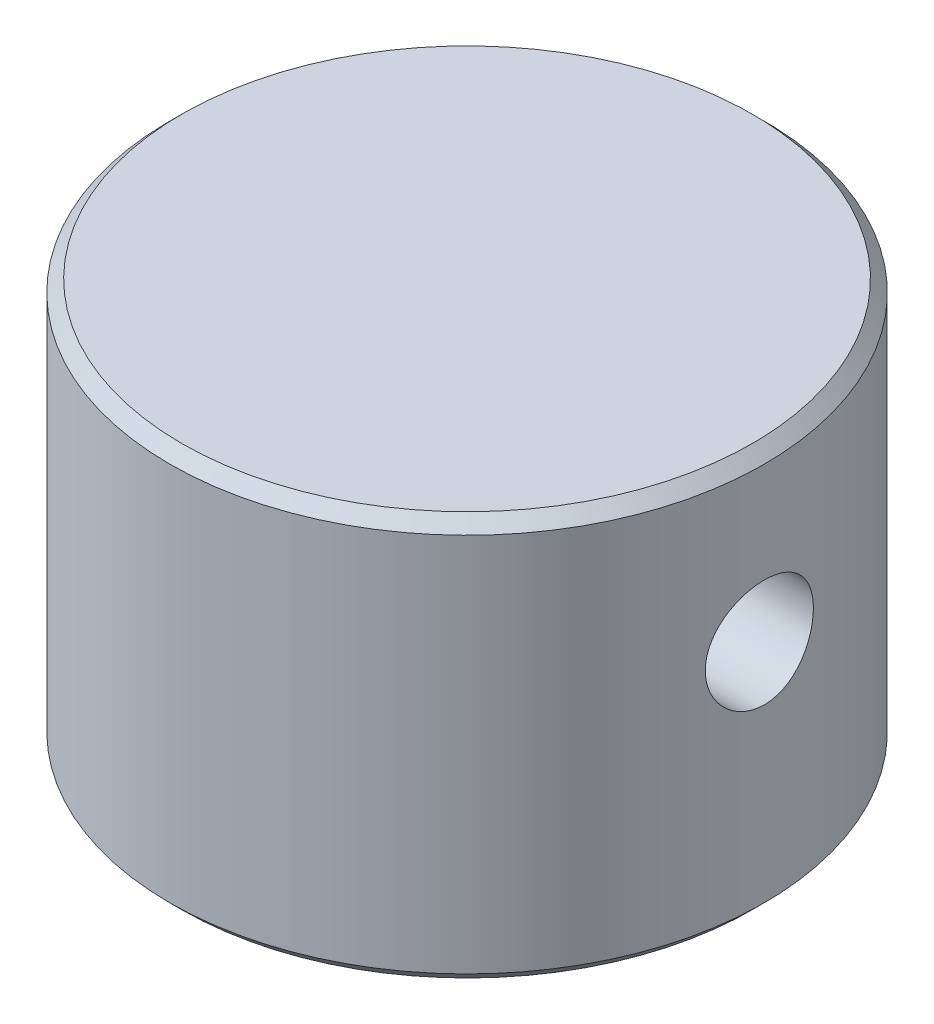
ISO-10303-21;
HEADER;
FILE_DESCRIPTION(('STEP AP214'),'2;1');
FILE_NAME('part.step','',(''),(''),'','','');
FILE_SCHEMA(('AUTOMOTIVE_DESIGN { 1 0 10303 214 1 1 1 1 }'));
ENDSEC;
DATA;
#1=APPLICATION_CONTEXT('core data for automotive mechanical design processes');
#2=APPLICATION_PROTOCOL_DEFINITION('international standard','automotive_design',2000,#1);
#3=PRODUCT_CONTEXT('',#1,'mechanical');
#4=PRODUCT('Part','Part','',(#3));
#5=PRODUCT_RELATED_PRODUCT_CATEGORY('part','',(#4));
#6=PRODUCT_DEFINITION_FORMATION('','',#4);
#7=PRODUCT_DEFINITION_CONTEXT('part definition',#1,'design');
#8=PRODUCT_DEFINITION('design','',#6,#7);
#9=PRODUCT_DEFINITION_SHAPE('','',#8);
#10=(LENGTH_UNIT() NAMED_UNIT(*) SI_UNIT(.MILLI.,.METRE.));
#11=(NAMED_UNIT(*) PLANE_ANGLE_UNIT() SI_UNIT($,.RADIAN.));
#12=(NAMED_UNIT(*) SI_UNIT($,.STERADIAN.) SOLID_ANGLE_UNIT());
#13=UNCERTAINTY_MEASURE_WITH_UNIT(LENGTH_MEASURE(1.E-05),#10,'distance_accuracy_value','');
#14=(GEOMETRIC_REPRESENTATION_CONTEXT(3) GLOBAL_UNCERTAINTY_ASSIGNED_CONTEXT((#13)) GLOBAL_UNIT_ASSIGNED_CONTEXT((#10,
#11,#12)) REPRESENTATION_CONTEXT('',''));
#15=CARTESIAN_POINT('',(0.,0.,0.));
#16=DIRECTION('',(0.,0.,1.));
#17=DIRECTION('',(1.,0.,0.));
#18=AXIS2_PLACEMENT_3D('',#15,#16,#17);
#19=CARTESIAN_POINT('',(0.,15.5,0.));
#20=DIRECTION('',(0.,-1.,0.));
#21=DIRECTION('',(0.,0.,-1.));
#22=AXIS2_PLACEMENT_3D('',#19,#20,#21);
#23=CYLINDRICAL_SURFACE('',#22,11.);
#24=CARTESIAN_POINT('',(0.,0.,0.));
#25=DIRECTION('',(0.,-1.,0.));
#26=DIRECTION('',(0.,0.,-1.));
#27=AXIS2_PLACEMENT_3D('',#24,#25,#26);
#28=CIRCLE('',#27,11.);
#29=CARTESIAN_POINT('',(0.,0.,-11.));
#30=VERTEX_POINT('',#29);
#31=EDGE_CURVE('E110',#30,#30,#28,.T.);
#32=ORIENTED_EDGE('',*,*,#31,.T.);
#33=EDGE_LOOP('',(#32));
#34=FACE_BOUND('',#33,.T.);
#35=DIRECTION('',(0.,1.,0.));
#36=VECTOR('',#35,1.);
#37=CARTESIAN_POINT('',(4.,6.5,10.2469507659596));
#38=LINE('',#37,#36);
#39=CARTESIAN_POINT('',(4.,6.5,10.2469507659596));
#40=VERTEX_POINT('',#39);
#41=CARTESIAN_POINT('',(4.,15.5,10.2469507659596));
#42=VERTEX_POINT('',#41);
#43=EDGE_CURVE('E61',#40,#42,#38,.T.);
#44=ORIENTED_EDGE('',*,*,#43,.F.);
#45=CARTESIAN_POINT('',(0.,6.5,0.));
#46=DIRECTION('',(0.,-1.,0.));
#47=DIRECTION('',(0.,0.,-1.));
#48=AXIS2_PLACEMENT_3D('',#45,#46,#47);
#49=CIRCLE('',#48,11.);
#50=CARTESIAN_POINT('',(4.,6.5,-10.2469507659596));
#51=VERTEX_POINT('',#50);
#52=EDGE_CURVE('E95',#51,#40,#49,.T.);
#53=ORIENTED_EDGE('',*,*,#52,.F.);
#54=DIRECTION('',(0.,1.,0.));
#55=VECTOR('',#54,1.);
#56=CARTESIAN_POINT('',(4.,6.5,-10.2469507659596));
#57=LINE('',#56,#55);
#58=CARTESIAN_POINT('',(4.,15.5,-10.2469507659596));
#59=VERTEX_POINT('',#58);
#60=EDGE_CURVE('E89',#51,#59,#57,.T.);
#61=ORIENTED_EDGE('',*,*,#60,.T.);
#62=CARTESIAN_POINT('',(0.,15.5,0.));
#63=DIRECTION('',(0.,-1.,0.));
#64=DIRECTION('',(0.,0.,-1.));
#65=AXIS2_PLACEMENT_3D('',#62,#63,#64);
#66=CIRCLE('',#65,11.);
#67=CARTESIAN_POINT('',(-4.,15.5,-10.2469507659596));
#68=VERTEX_POINT('',#67);
#69=EDGE_CURVE('E99',#68,#59,#66,.T.);
#70=ORIENTED_EDGE('',*,*,#69,.F.);
#71=DIRECTION('',(0.,1.,0.));
#72=VECTOR('',#71,1.);
#73=CARTESIAN_POINT('',(-4.,6.5,-10.2469507659596));
#74=LINE('',#73,#72);
#75=CARTESIAN_POINT('',(-4.,6.5,-10.2469507659596));
#76=VERTEX_POINT('',#75);
#77=EDGE_CURVE('E69',#76,#68,#74,.T.);
#78=ORIENTED_EDGE('',*,*,#77,.F.);
#79=CARTESIAN_POINT('',(0.,6.5,0.));
#80=DIRECTION('',(0.,-1.,0.));
#81=DIRECTION('',(0.,0.,-1.));
#82=AXIS2_PLACEMENT_3D('',#79,#80,#81);
#83=CIRCLE('',#82,11.);
#84=CARTESIAN_POINT('',(-4.,6.5,10.2469507659596));
#85=VERTEX_POINT('',#84);
#86=EDGE_CURVE('E198',#85,#76,#83,.T.);
#87=ORIENTED_EDGE('',*,*,#86,.F.);
#88=DIRECTION('',(0.,1.,0.));
#89=VECTOR('',#88,1.);
#90=CARTESIAN_POINT('',(-4.,6.5,10.2469507659596));
#91=LINE('',#90,#89);
#92=CARTESIAN_POINT('',(-4.,15.5,10.2469507659596));
#93=VERTEX_POINT('',#92);
#94=EDGE_CURVE('E196',#85,#93,#91,.T.);
#95=ORIENTED_EDGE('',*,*,#94,.T.);
#96=EDGE_CURVE('E105',#42,#93,#66,.T.);
#97=ORIENTED_EDGE('',*,*,#96,.F.);
#98=EDGE_LOOP('',(#44,#53,#61,#70,#78,#87,#95,#97));
#99=FACE_BOUND('',#98,.T.);
#100=ADVANCED_FACE('F45',(#34,#99),#23,.F.);
#101=CARTESIAN_POINT('',(0.,15.5,0.));
#102=DIRECTION('',(0.,-1.,0.));
#103=DIRECTION('',(0.,0.,-1.));
#104=AXIS2_PLACEMENT_3D('',#101,#102,#103);
#105=PLANE('',#104);
#106=ORIENTED_EDGE('',*,*,#69,.T.);
#107=DIRECTION('',(0.,0.,-1.));
#108=VECTOR('',#107,1.);
#109=CARTESIAN_POINT('',(4.,15.5,10.2469507659596));
#110=LINE('',#109,#108);
#111=EDGE_CURVE('E86',#42,#59,#110,.T.);
#112=ORIENTED_EDGE('',*,*,#111,.F.);
#113=ORIENTED_EDGE('',*,*,#96,.T.);
#114=DIRECTION('',(0.,0.,1.));
#115=VECTOR('',#114,1.);
#116=CARTESIAN_POINT('',(-4.,15.5,10.2469507659596));
#117=LINE('',#116,#115);
#118=EDGE_CURVE('E94',#68,#93,#117,.T.);
#119=ORIENTED_EDGE('',*,*,#118,.F.);
#120=EDGE_LOOP('',(#106,#112,#113,#119));
#121=FACE_BOUND('',#120,.T.);
#122=ADVANCED_FACE('F103',(#121),#105,.T.);
#123=CARTESIAN_POINT('',(0.,16.915,0.));
#124=DIRECTION('',(0.,-1.,0.));
#125=DIRECTION('',(0.,0.,-1.));
#126=AXIS2_PLACEMENT_3D('',#123,#124,#125);
#127=CYLINDRICAL_SURFACE('',#126,12.45);
#128=CARTESIAN_POINT('',(0.,0.499999999999997,0.));
#129=DIRECTION('',(0.,1.,0.));
#130=DIRECTION('',(0.,0.,1.));
#131=AXIS2_PLACEMENT_3D('',#128,#129,#130);
#132=CIRCLE('',#131,12.45);
#133=CARTESIAN_POINT('',(0.,0.499999999999997,12.45));
#134=VERTEX_POINT('',#133);
#135=EDGE_CURVE('E54',#134,#134,#132,.T.);
#136=ORIENTED_EDGE('',*,*,#135,.T.);
#137=EDGE_LOOP('',(#136));
#138=FACE_BOUND('',#137,.T.);
#139=CARTESIAN_POINT('',(0.,16.415,0.));
#140=DIRECTION('',(0.,1.,0.));
#141=DIRECTION('',(0.,0.,1.));
#142=AXIS2_PLACEMENT_3D('',#139,#140,#141);
#143=CIRCLE('',#142,12.45);
#144=CARTESIAN_POINT('',(0.,16.415,12.45));
#145=VERTEX_POINT('',#144);
#146=EDGE_CURVE('E108',#145,#145,#143,.F.);
#147=ORIENTED_EDGE('',*,*,#146,.T.);
#148=EDGE_LOOP('',(#147));
#149=FACE_BOUND('',#148,.T.);
#150=CARTESIAN_POINT('',(-12.45,7.685,0.));
#151=CARTESIAN_POINT('',(-12.4499977426954,7.6850048894987,-0.126110784394355));
#152=CARTESIAN_POINT('',(-12.448064030792,7.69556799319303,-0.252285981732522));
#153=CARTESIAN_POINT('',(-12.4405364019549,7.73751679929563,-0.501085484450616));
#154=CARTESIAN_POINT('',(-12.4349393188572,7.76892051407336,-0.623706622320782));
#155=CARTESIAN_POINT('',(-12.420711521694,7.85156097050158,-0.86176343618399));
#156=CARTESIAN_POINT('',(-12.4120834765326,7.90278026760977,-0.977205328916732));
#157=CARTESIAN_POINT('',(-12.392737733366,8.02354948222279,-1.19784518596608));
#158=CARTESIAN_POINT('',(-12.3820202238136,8.09309774680087,-1.30304407283745));
#159=CARTESIAN_POINT('',(-12.3595444647763,8.24938577093528,-1.50141275080277));
#160=CARTESIAN_POINT('',(-12.3477767773887,8.3362924477928,-1.59444997784525));
#161=CARTESIAN_POINT('',(-12.3245976045918,8.52447119549112,-1.76470800715784));
#162=CARTESIAN_POINT('',(-12.3131861439171,8.62574426116577,-1.84192771320131));
#163=CARTESIAN_POINT('',(-12.2919198591133,8.84071064011872,-1.97890453943675));
#164=CARTESIAN_POINT('',(-12.282077212325,8.95449052846281,-2.03852784848569));
#165=CARTESIAN_POINT('',(-12.2651954340577,9.19066065890616,-2.13776304719744));
#166=CARTESIAN_POINT('',(-12.2581560755828,9.31305020289508,-2.17737655722059));
#167=CARTESIAN_POINT('',(-12.2477726259455,9.5615505698503,-2.23504436422881));
#168=CARTESIAN_POINT('',(-12.24438904625,9.68760620592733,-2.25332922166536));
#169=CARTESIAN_POINT('',(-12.2415810988507,9.94103812685328,-2.26853611272031));
#170=CARTESIAN_POINT('',(-12.2421563970993,10.0684142993705,-2.26545994876845));
#171=CARTESIAN_POINT('',(-12.2471652224839,10.3192080533194,-2.23821930674219));
#172=CARTESIAN_POINT('',(-12.2515509445123,10.442655109894,-2.21431611145934));
#173=CARTESIAN_POINT('',(-12.2636114419683,10.6837570593277,-2.14651101092757));
#174=CARTESIAN_POINT('',(-12.2712863497115,10.8014117189611,-2.10260830114425));
#175=CARTESIAN_POINT('',(-12.289110889421,11.028358510305,-1.99579228677992));
#176=CARTESIAN_POINT('',(-12.2992743005367,11.1375994675561,-1.93277264849734));
#177=CARTESIAN_POINT('',(-12.3209214538996,11.3440548433519,-1.78958695524558));
#178=CARTESIAN_POINT('',(-12.3324053224915,11.4412681092064,-1.7094192588747));
#179=CARTESIAN_POINT('',(-12.3556082440171,11.6224189953772,-1.53280024523489));
#180=CARTESIAN_POINT('',(-12.3673282604176,11.7061385600773,-1.43612524710473));
#181=CARTESIAN_POINT('',(-12.3895263001221,11.8562032763446,-1.2299865797318));
#182=CARTESIAN_POINT('',(-12.4000043123169,11.9225482725104,-1.12052279611629));
#183=CARTESIAN_POINT('',(-12.4185570692452,12.0360092404384,-0.891692632151408));
#184=CARTESIAN_POINT('',(-12.426629095874,12.0831034862575,-0.772315245275205));
#185=CARTESIAN_POINT('',(-12.4394391798877,12.1565107235421,-0.527164847249272));
#186=CARTESIAN_POINT('',(-12.4441775703828,12.1828257913778,-0.401392476458874));
#187=CARTESIAN_POINT('',(-12.4497410071205,12.2136263802156,-0.148899282379695));
#188=CARTESIAN_POINT('',(-12.4506196374617,12.2184108284683,-0.0222160655405511));
#189=CARTESIAN_POINT('',(-12.4485122228269,12.2068148450246,0.23014058088427));
#190=CARTESIAN_POINT('',(-12.4455263561775,12.1904353899337,0.355814056795051));
#191=CARTESIAN_POINT('',(-12.4360587512915,12.1372251242161,0.601642565991784));
#192=CARTESIAN_POINT('',(-12.4296027231313,12.1005446631283,0.721831219122875));
#193=CARTESIAN_POINT('',(-12.4139156752847,12.0079356336392,0.954353016596404));
#194=CARTESIAN_POINT('',(-12.4046844759272,11.952005818955,1.06668565174094));
#195=CARTESIAN_POINT('',(-12.3843374619874,11.8218177166846,1.28158879908606));
#196=CARTESIAN_POINT('',(-12.3732031222179,11.7473756367059,1.38404618079781));
#197=CARTESIAN_POINT('',(-12.3503347538532,11.5825259801935,1.57512175949429));
#198=CARTESIAN_POINT('',(-12.3386006728225,11.4921170059699,1.66373874365489));
#199=CARTESIAN_POINT('',(-12.315678799703,11.2965500345022,1.82574619606954));
#200=CARTESIAN_POINT('',(-12.3044996347672,11.1912223205665,1.89893321190699));
#201=CARTESIAN_POINT('',(-12.2841233798363,10.9695920769724,2.02657545067743));
#202=CARTESIAN_POINT('',(-12.2749262189434,10.8532899400922,2.08103134367952));
#203=CARTESIAN_POINT('',(-12.2596221962818,10.613543299958,2.16937263412066));
#204=CARTESIAN_POINT('',(-12.2535010135576,10.4901349341586,2.20335350805423));
#205=CARTESIAN_POINT('',(-12.2450083674301,10.239239436915,2.25007642329087));
#206=CARTESIAN_POINT('',(-12.2426365084548,10.1117527372033,2.26282070516581));
#207=CARTESIAN_POINT('',(-12.2419302974058,9.85835552193748,2.26663714338914));
#208=CARTESIAN_POINT('',(-12.2435361953138,9.73244989065503,2.25803001704086));
#209=CARTESIAN_POINT('',(-12.250472493709,9.48391159205289,2.2200877100499));
#210=CARTESIAN_POINT('',(-12.2558028749717,9.36127890784286,2.19075263639711));
#211=CARTESIAN_POINT('',(-12.2695630535139,9.12292664620641,2.11231907137455));
#212=CARTESIAN_POINT('',(-12.2779877114752,9.00719597353527,2.06325333812891));
#213=CARTESIAN_POINT('',(-12.2969911718045,8.78555769624903,1.94678567716381));
#214=CARTESIAN_POINT('',(-12.3075701139396,8.67965072963199,1.87938255964413));
#215=CARTESIAN_POINT('',(-12.3298767496807,8.47905571283178,1.72703016512269));
#216=CARTESIAN_POINT('',(-12.3416185450702,8.38454703149265,1.64184674809391));
#217=CARTESIAN_POINT('',(-12.3648204809275,8.2110575088427,1.4568417884492));
#218=CARTESIAN_POINT('',(-12.3762805560294,8.13208024199231,1.3570168853916));
#219=CARTESIAN_POINT('',(-12.3977404325838,7.99127885423213,1.14455955221186));
#220=CARTESIAN_POINT('',(-12.4077271555153,7.92960443262849,1.03182655826912));
#221=CARTESIAN_POINT('',(-12.4249876326136,7.82616781233138,0.797456460030632));
#222=CARTESIAN_POINT('',(-12.4322639767424,7.78438659357082,0.675827989685098));
#223=CARTESIAN_POINT('',(-12.4417710566469,7.73057014191343,0.461507075876561));
#224=CARTESIAN_POINT('',(-12.4448397462954,7.71351002337008,0.37008046531215));
#225=CARTESIAN_POINT('',(-12.4489550262711,7.69072328134514,0.185780867747085));
#226=CARTESIAN_POINT('',(-12.4500016629939,7.68499639782492,0.0929079139817438));
#227=CARTESIAN_POINT('',(-12.45,7.685,0.));
#228=B_SPLINE_CURVE_WITH_KNOTS('',3,(#150,#151,#152,#153,#154,#155,#156,#157,#158,#159,#160,
#161,#162,#163,#164,#165,#166,#167,#168,#169,#170,#171,#172,#173,#174,#175,#176,#177,#178,#179,
#180,#181,#182,#183,#184,#185,#186,#187,#188,#189,#190,#191,#192,#193,#194,#195,#196,#197,#198,
#199,#200,#201,#202,#203,#204,#205,#206,#207,#208,#209,#210,#211,#212,#213,#214,#215,#216,#217,
#218,#219,#220,#221,#222,#223,#224,#225,#226,#227),.UNSPECIFIED.,.T.,.F.,(4,2,2,2,2,2,2,2,2,2,2,
2,2,2,2,2,2,2,2,2,2,2,2,2,2,2,2,2,2,2,2,2,2,2,2,2,2,2,4),(0.,0.377992629896201,
0.756312381944009,1.13429983730916,1.5122532170009,1.89403297232022,2.2758391777791,
2.6604781250542,3.04508591990991,3.42549644392335,3.80587486952251,4.18154891908036,
4.55723808247465,4.93505649129427,5.31291108085863,5.69636452515796,6.07982139902268,
6.463709846351,6.84755992856755,7.2260639258641,7.60455045776698,7.98027071270586,
8.3560152979088,8.73565067862389,9.11531930787274,9.49971800067114,9.8841029409316,
10.2666813084587,10.649219309405,11.0260461395937,11.4028710247578,11.7790728468796,
12.1552990842507,12.5368334684825,12.9184555580319,13.303284104194,13.6877439698311,
13.9662238217103,14.2446972838554),.UNSPECIFIED.);
#229=CARTESIAN_POINT('',(-12.45,7.685,0.));
#230=VERTEX_POINT('',#229);
#231=EDGE_CURVE('E166',#230,#230,#228,.T.);
#232=ORIENTED_EDGE('',*,*,#231,.T.);
#233=EDGE_LOOP('',(#232));
#234=FACE_BOUND('',#233,.T.);
#235=CARTESIAN_POINT('',(12.2422332521481,9.95,-2.265));
#236=CARTESIAN_POINT('',(12.242235654484,9.82390868356505,-2.26499509478145));
#237=CARTESIAN_POINT('',(12.2442024488543,9.69775290935885,-2.25443514192727));
#238=CARTESIAN_POINT('',(12.2518480600948,9.44899374366444,-2.21249998552055));
#239=CARTESIAN_POINT('',(12.25753010214,9.32639353539298,-2.18110669637123));
#240=CARTESIAN_POINT('',(12.2719418569047,9.08838103137079,-2.09849672354635));
#241=CARTESIAN_POINT('',(12.2806688115007,8.97296234161537,-2.04729797538022));
#242=CARTESIAN_POINT('',(12.3001838217114,8.7523615514841,-1.92657718992653));
#243=CARTESIAN_POINT('',(12.3109716967904,8.6471785556827,-1.85705675740915));
#244=CARTESIAN_POINT('',(12.3335342974131,8.44879271799741,-1.70079717692069));
#245=CARTESIAN_POINT('',(12.3453181969632,8.35572729102658,-1.61388486722115));
#246=CARTESIAN_POINT('',(12.3684639443284,8.18541461118267,-1.42568291110938));
#247=CARTESIAN_POINT('',(12.3798257651683,8.10816836789756,-1.32439234776809));
#248=CARTESIAN_POINT('',(12.4009451497643,7.97116315706824,-1.10940986150661));
#249=CARTESIAN_POINT('',(12.4106906503141,7.91153329803879,-0.995634373180463));
#250=CARTESIAN_POINT('',(12.4273768147182,7.8122847864181,-0.759473774145506));
#251=CARTESIAN_POINT('',(12.4343176956581,7.77266458496249,-0.637089330655842));
#252=CARTESIAN_POINT('',(12.4445477824144,7.7149837257226,-0.38860777170703));
#253=CARTESIAN_POINT('',(12.4478761639926,7.69669161054418,-0.26256602467063));
#254=CARTESIAN_POINT('',(12.4506411439628,7.68146538755095,-0.00916153472613432));
#255=CARTESIAN_POINT('',(12.450078055149,7.68452956312892,0.118201101187925));
#256=CARTESIAN_POINT('',(12.4451542641646,7.71175059557765,0.369046032613975));
#257=CARTESIAN_POINT('',(12.4408384279041,7.73565826728763,0.492556376580055));
#258=CARTESIAN_POINT('',(12.4289442975051,7.80349401619445,0.733782562486481));
#259=CARTESIAN_POINT('',(12.4213658896948,7.8474227909528,0.851498202373383));
#260=CARTESIAN_POINT('',(12.4037227325798,7.95429402606181,1.07852133474285));
#261=CARTESIAN_POINT('',(12.393644898736,8.01733694861735,1.18778047622991));
#262=CARTESIAN_POINT('',(12.3721188528593,8.16057302120123,1.39426247613211));
#263=CARTESIAN_POINT('',(12.3606705093859,8.24076781678266,1.49148417825957));
#264=CARTESIAN_POINT('',(12.3374778070463,8.41740687634807,1.67260683218149));
#265=CARTESIAN_POINT('',(12.3257315609356,8.51406909408838,1.75629512193428));
#266=CARTESIAN_POINT('',(12.3034254916455,8.72017076853033,1.9063027115644));
#267=CARTESIAN_POINT('',(12.2928656838789,8.8296103911822,1.97262178581776));
#268=CARTESIAN_POINT('',(12.2741258288104,9.05843236345511,2.0860637247554));
#269=CARTESIAN_POINT('',(12.2659494344445,9.17782961820348,2.13315716707499));
#270=CARTESIAN_POINT('',(12.2529592446962,9.42302343718645,2.20655678860922));
#271=CARTESIAN_POINT('',(12.2481450922768,9.54881932042729,2.23286517503096));
#272=CARTESIAN_POINT('',(12.2424946881197,9.8013259962794,2.26364048008713));
#273=CARTESIAN_POINT('',(12.2416029168454,9.92799842693771,2.26841226510619));
#274=CARTESIAN_POINT('',(12.2437498680003,10.1803305255913,2.25679480724522));
#275=CARTESIAN_POINT('',(12.2467884080258,10.3059902403139,2.24040654639251));
#276=CARTESIAN_POINT('',(12.2564020158286,10.5517370882366,2.18719543079884));
#277=CARTESIAN_POINT('',(12.2629496363923,10.6718597162726,2.15053110074012));
#278=CARTESIAN_POINT('',(12.2788201803208,10.9042565442765,2.05797626904307));
#279=CARTESIAN_POINT('',(12.288143297705,11.0165301948892,2.00208442327582));
#280=CARTESIAN_POINT('',(12.308641504312,11.2313889474747,1.8719544976582));
#281=CARTESIAN_POINT('',(12.3198356752151,11.3338550839323,1.79752305458498));
#282=CARTESIAN_POINT('',(12.34276042974,11.5249532289261,1.63268880012397));
#283=CARTESIAN_POINT('',(12.3544910585834,11.6135840684036,1.5422846404437));
#284=CARTESIAN_POINT('',(12.3773446204807,11.7756275138727,1.34671258591381));
#285=CARTESIAN_POINT('',(12.3884580993773,11.8488355587706,1.24137392258478));
#286=CARTESIAN_POINT('',(12.4086682307419,11.9765146454697,1.019715587856));
#287=CARTESIAN_POINT('',(12.4177649575901,12.0309863783294,0.903396321659798));
#288=CARTESIAN_POINT('',(12.4328758520627,12.1193369724373,0.663655637804169));
#289=CARTESIAN_POINT('',(12.43890530667,12.1533181171638,0.540272919767174));
#290=CARTESIAN_POINT('',(12.4472673549439,12.2000502418214,0.289432003620552));
#291=CARTESIAN_POINT('',(12.4496003138303,12.2128033191269,0.161974209404775));
#292=CARTESIAN_POINT('',(12.4502998322014,12.2166477898172,-0.0914336012731567));
#293=CARTESIAN_POINT('',(12.448723078473,12.2080487640499,-0.217378869885648));
#294=CARTESIAN_POINT('',(12.4418975496044,12.170108809138,-0.465998587825397));
#295=CARTESIAN_POINT('',(12.4366488053235,12.1407680543066,-0.588673064631343));
#296=CARTESIAN_POINT('',(12.4230683299058,12.0623048106595,-0.827117862985562));
#297=CARTESIAN_POINT('',(12.4147414509972,12.0132134450833,-0.94289871957637));
#298=CARTESIAN_POINT('',(12.3959081984051,11.8966788251233,-1.16462683938882));
#299=CARTESIAN_POINT('',(12.3854016902902,11.8292344387134,-1.27057349548991));
#300=CARTESIAN_POINT('',(12.3631907298415,11.6768336968604,-1.47117329558495));
#301=CARTESIAN_POINT('',(12.3514719955156,11.5916528000497,-1.56565428802943));
#302=CARTESIAN_POINT('',(12.3282498638093,11.4066646537088,-1.73908911444023));
#303=CARTESIAN_POINT('',(12.3167465176233,11.306853975455,-1.81803929832606));
#304=CARTESIAN_POINT('',(12.2951495036973,11.0944109799087,-1.95880791542873));
#305=CARTESIAN_POINT('',(12.2850688549668,10.9816754678859,-2.02047265903811));
#306=CARTESIAN_POINT('',(12.2676143765959,10.7473007386762,-2.12389051072394));
#307=CARTESIAN_POINT('',(12.2602379516289,10.6256701935452,-2.16566272185016));
#308=CARTESIAN_POINT('',(12.2505926947932,10.4113726506732,-2.21945657187866));
#309=CARTESIAN_POINT('',(12.2474761838339,10.3199729903701,-2.23650661775603));
#310=CARTESIAN_POINT('',(12.2432956028131,10.1357271881314,-2.2592799999158));
#311=CARTESIAN_POINT('',(12.2422314825452,10.0428810816354,-2.26500361327027));
#312=CARTESIAN_POINT('',(12.2422332521481,9.95,-2.265));
#313=B_SPLINE_CURVE_WITH_KNOTS('',3,(#235,#236,#237,#238,#239,#240,#241,#242,#243,#244,#245,
#246,#247,#248,#249,#250,#251,#252,#253,#254,#255,#256,#257,#258,#259,#260,#261,#262,#263,#264,
#265,#266,#267,#268,#269,#270,#271,#272,#273,#274,#275,#276,#277,#278,#279,#280,#281,#282,#283,
#284,#285,#286,#287,#288,#289,#290,#291,#292,#293,#294,#295,#296,#297,#298,#299,#300,#301,#302,
#303,#304,#305,#306,#307,#308,#309,#310,#311,#312),.UNSPECIFIED.,.T.,.F.,(4,2,2,2,2,2,2,2,2,2,2,
2,2,2,2,2,2,2,2,2,2,2,2,2,2,2,2,2,2,2,2,2,2,2,2,2,2,2,4),(0.,0.377934121855245,
0.756196761476765,1.13411765134908,1.51200545066507,1.8938617875213,2.27574248704434,
2.66035621071574,3.04494015847395,3.42531047806645,3.8056502240487,4.18150438942401,
4.55737165105292,4.93524972831173,5.31316407552172,5.69653640471709,6.07991371362483,
6.46387555260564,6.84779661242037,7.22626558613586,7.60471699592379,7.98025054940431,
8.35581036046955,8.73546442649694,9.11515055529169,9.49959331319608,9.88402189002856,
10.266515266077,10.6489708487921,11.0259137354442,11.4028534543122,11.7792014992993,
12.1555727629381,12.5370351507096,12.918587083676,13.3034310389378,13.687904674693,
13.9663044071409,14.2446973291703),.UNSPECIFIED.);
#314=CARTESIAN_POINT('',(12.2422332521481,9.95,-2.265));
#315=VERTEX_POINT('',#314);
#316=EDGE_CURVE('E159',#315,#315,#313,.T.);
#317=ORIENTED_EDGE('',*,*,#316,.T.);
#318=EDGE_LOOP('',(#317));
#319=FACE_BOUND('',#318,.T.);
#320=ADVANCED_FACE('F124',(#138,#149,#234,#319),#127,.T.);
#321=CARTESIAN_POINT('',(0.,16.915,0.));
#322=DIRECTION('',(0.,1.,0.));
#323=DIRECTION('',(0.,0.,1.));
#324=AXIS2_PLACEMENT_3D('',#321,#322,#323);
#325=PLANE('',#324);
#326=CARTESIAN_POINT('',(0.,16.915,0.));
#327=DIRECTION('',(0.,1.,0.));
#328=DIRECTION('',(0.,0.,1.));
#329=AXIS2_PLACEMENT_3D('',#326,#327,#328);
#330=CIRCLE('',#329,11.95);
#331=CARTESIAN_POINT('',(0.,16.915,11.95));
#332=VERTEX_POINT('',#331);
#333=EDGE_CURVE('E104',#332,#332,#330,.T.);
#334=ORIENTED_EDGE('',*,*,#333,.T.);
#335=EDGE_LOOP('',(#334));
#336=FACE_BOUND('',#335,.T.);
#337=ADVANCED_FACE('F146',(#336),#325,.T.);
#338=CARTESIAN_POINT('',(0.,0.,0.));
#339=DIRECTION('',(0.,1.,0.));
#340=DIRECTION('',(0.,0.,1.));
#341=AXIS2_PLACEMENT_3D('',#338,#339,#340);
#342=PLANE('',#341);
#343=CARTESIAN_POINT('',(0.,0.,0.));
#344=DIRECTION('',(0.,1.,0.));
#345=DIRECTION('',(0.,0.,1.));
#346=AXIS2_PLACEMENT_3D('',#343,#344,#345);
#347=CIRCLE('',#346,11.95);
#348=CARTESIAN_POINT('',(0.,0.,11.95));
#349=VERTEX_POINT('',#348);
#350=EDGE_CURVE('E11',#349,#349,#347,.F.);
#351=ORIENTED_EDGE('',*,*,#350,.T.);
#352=EDGE_LOOP('',(#351));
#353=FACE_BOUND('',#352,.T.);
#354=ORIENTED_EDGE('',*,*,#31,.F.);
#355=EDGE_LOOP('',(#354));
#356=FACE_BOUND('',#355,.T.);
#357=ADVANCED_FACE('F149',(#353,#356),#342,.F.);
#358=CARTESIAN_POINT('',(-4.,6.5,10.2469507659596));
#359=DIRECTION('',(-1.,0.,0.));
#360=DIRECTION('',(0.,0.,1.));
#361=AXIS2_PLACEMENT_3D('',#358,#359,#360);
#362=PLANE('',#361);
#363=CARTESIAN_POINT('',(-4.,9.95,0.));
#364=DIRECTION('',(-1.,0.,0.));
#365=DIRECTION('',(0.,0.,1.));
#366=AXIS2_PLACEMENT_3D('',#363,#364,#365);
#367=CIRCLE('',#366,2.265);
#368=CARTESIAN_POINT('',(-4.,9.95,2.265));
#369=VERTEX_POINT('',#368);
#370=EDGE_CURVE('E118',#369,#369,#367,.T.);
#371=ORIENTED_EDGE('',*,*,#370,.T.);
#372=EDGE_LOOP('',(#371));
#373=FACE_BOUND('',#372,.T.);
#374=ORIENTED_EDGE('',*,*,#118,.T.);
#375=ORIENTED_EDGE('',*,*,#94,.F.);
#376=DIRECTION('',(0.,0.,1.));
#377=VECTOR('',#376,1.);
#378=CARTESIAN_POINT('',(-4.,6.5,10.2469507659596));
#379=LINE('',#378,#377);
#380=EDGE_CURVE('E201',#76,#85,#379,.T.);
#381=ORIENTED_EDGE('',*,*,#380,.F.);
#382=ORIENTED_EDGE('',*,*,#77,.T.);
#383=EDGE_LOOP('',(#374,#375,#381,#382));
#384=FACE_BOUND('',#383,.T.);
#385=ADVANCED_FACE('F152',(#373,#384),#362,.F.);
#386=CARTESIAN_POINT('',(0.,6.5,0.));
#387=DIRECTION('',(0.,-1.,0.));
#388=DIRECTION('',(0.,0.,-1.));
#389=AXIS2_PLACEMENT_3D('',#386,#387,#388);
#390=PLANE('',#389);
#391=ORIENTED_EDGE('',*,*,#86,.T.);
#392=ORIENTED_EDGE('',*,*,#380,.T.);
#393=EDGE_LOOP('',(#391,#392));
#394=FACE_BOUND('',#393,.T.);
#395=ADVANCED_FACE('F181',(#394),#390,.T.);
#396=CARTESIAN_POINT('',(4.,6.5,10.2469507659596));
#397=DIRECTION('',(1.,0.,0.));
#398=DIRECTION('',(0.,0.,-1.));
#399=AXIS2_PLACEMENT_3D('',#396,#397,#398);
#400=PLANE('',#399);
#401=CARTESIAN_POINT('',(4.,9.95,0.));
#402=DIRECTION('',(1.,0.,0.));
#403=DIRECTION('',(0.,0.,-1.));
#404=AXIS2_PLACEMENT_3D('',#401,#402,#403);
#405=CIRCLE('',#404,2.265);
#406=CARTESIAN_POINT('',(4.,9.95,-2.265));
#407=VERTEX_POINT('',#406);
#408=EDGE_CURVE('E116',#407,#407,#405,.T.);
#409=ORIENTED_EDGE('',*,*,#408,.T.);
#410=EDGE_LOOP('',(#409));
#411=FACE_BOUND('',#410,.T.);
#412=ORIENTED_EDGE('',*,*,#111,.T.);
#413=ORIENTED_EDGE('',*,*,#60,.F.);
#414=DIRECTION('',(0.,0.,-1.));
#415=VECTOR('',#414,1.);
#416=CARTESIAN_POINT('',(4.,6.5,10.2469507659596));
#417=LINE('',#416,#415);
#418=EDGE_CURVE('E101',#40,#51,#417,.T.);
#419=ORIENTED_EDGE('',*,*,#418,.F.);
#420=ORIENTED_EDGE('',*,*,#43,.T.);
#421=EDGE_LOOP('',(#412,#413,#419,#420));
#422=FACE_BOUND('',#421,.T.);
#423=ADVANCED_FACE('F88',(#411,#422),#400,.F.);
#424=CARTESIAN_POINT('',(0.,6.5,0.));
#425=DIRECTION('',(0.,-1.,0.));
#426=DIRECTION('',(0.,0.,-1.));
#427=AXIS2_PLACEMENT_3D('',#424,#425,#426);
#428=PLANE('',#427);
#429=ORIENTED_EDGE('',*,*,#52,.T.);
#430=ORIENTED_EDGE('',*,*,#418,.T.);
#431=EDGE_LOOP('',(#429,#430));
#432=FACE_BOUND('',#431,.T.);
#433=ADVANCED_FACE('F180',(#432),#428,.T.);
#434=CARTESIAN_POINT('',(-12.45,9.95,0.));
#435=DIRECTION('',(1.,0.,0.));
#436=DIRECTION('',(0.,0.,-1.));
#437=AXIS2_PLACEMENT_3D('',#434,#435,#436);
#438=CYLINDRICAL_SURFACE('',#437,2.265);
#439=ORIENTED_EDGE('',*,*,#408,.F.);
#440=EDGE_LOOP('',(#439));
#441=FACE_BOUND('',#440,.T.);
#442=ORIENTED_EDGE('',*,*,#316,.F.);
#443=EDGE_LOOP('',(#442));
#444=FACE_BOUND('',#443,.T.);
#445=ADVANCED_FACE('F175',(#441,#444),#438,.F.);
#446=ORIENTED_EDGE('',*,*,#370,.F.);
#447=EDGE_LOOP('',(#446));
#448=FACE_BOUND('',#447,.T.);
#449=ORIENTED_EDGE('',*,*,#231,.F.);
#450=EDGE_LOOP('',(#449));
#451=FACE_BOUND('',#450,.T.);
#452=ADVANCED_FACE('F134',(#448,#451),#438,.F.);
#453=CARTESIAN_POINT('',(0.,16.915,0.));
#454=DIRECTION('',(0.,-1.,0.));
#455=DIRECTION('',(0.,0.,-1.));
#456=AXIS2_PLACEMENT_3D('',#453,#454,#455);
#457=CONICAL_SURFACE('',#456,11.95,0.785398163397447);
#458=ORIENTED_EDGE('',*,*,#146,.F.);
#459=EDGE_LOOP('',(#458));
#460=FACE_BOUND('',#459,.T.);
#461=ORIENTED_EDGE('',*,*,#333,.F.);
#462=EDGE_LOOP('',(#461));
#463=FACE_BOUND('',#462,.T.);
#464=ADVANCED_FACE('F128',(#460,#463),#457,.T.);
#465=CARTESIAN_POINT('',(0.,0.499999999999997,0.));
#466=DIRECTION('',(0.,1.,0.));
#467=DIRECTION('',(0.,0.,1.));
#468=AXIS2_PLACEMENT_3D('',#465,#466,#467);
#469=CONICAL_SURFACE('',#468,12.45,0.785398163397448);
#470=ORIENTED_EDGE('',*,*,#350,.F.);
#471=EDGE_LOOP('',(#470));
#472=FACE_BOUND('',#471,.T.);
#473=ORIENTED_EDGE('',*,*,#135,.F.);
#474=EDGE_LOOP('',(#473));
#475=FACE_BOUND('',#474,.T.);
#476=ADVANCED_FACE('F48',(#472,#475),#469,.T.);
#477=CLOSED_SHELL('',(#100,#122,#320,#337,#357,#385,#395,#423,#433,#445,#452,#464,#476));
#478=MANIFOLD_SOLID_BREP('B2',#477);
#479=ADVANCED_BREP_SHAPE_REPRESENTATION('',(#18,#478),#14);
#480=SHAPE_DEFINITION_REPRESENTATION(#9,#479);
ENDSEC;
END-ISO-10303-21;
